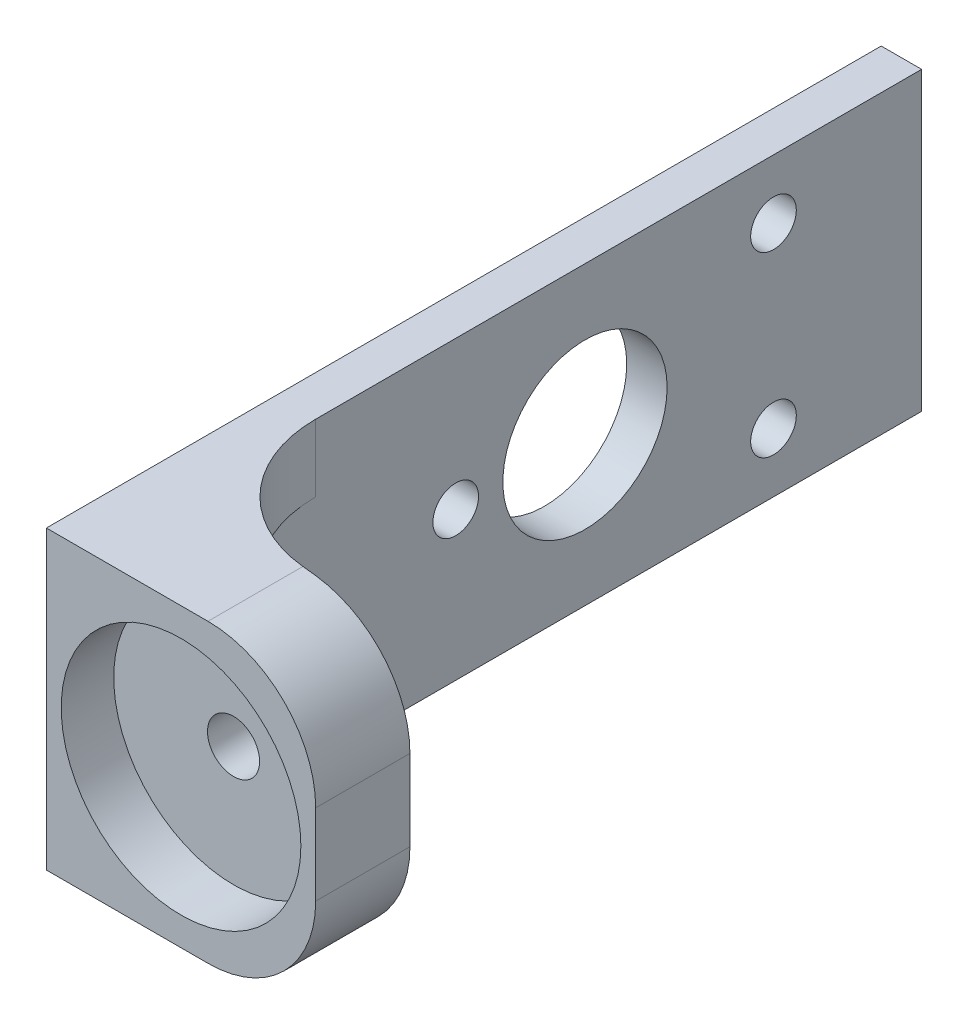
ISO-10303-21;
HEADER;
FILE_DESCRIPTION(('STEP AP214'),'2;1');
FILE_NAME('part.step','',(''),(''),'','','');
FILE_SCHEMA(('AUTOMOTIVE_DESIGN { 1 0 10303 214 1 1 1 1 }'));
ENDSEC;
DATA;
#1=APPLICATION_CONTEXT('core data for automotive mechanical design processes');
#2=APPLICATION_PROTOCOL_DEFINITION('international standard','automotive_design',2000,#1);
#3=PRODUCT_CONTEXT('',#1,'mechanical');
#4=PRODUCT('Part','Part','',(#3));
#5=PRODUCT_RELATED_PRODUCT_CATEGORY('part','',(#4));
#6=PRODUCT_DEFINITION_FORMATION('','',#4);
#7=PRODUCT_DEFINITION_CONTEXT('part definition',#1,'design');
#8=PRODUCT_DEFINITION('design','',#6,#7);
#9=PRODUCT_DEFINITION_SHAPE('','',#8);
#10=(LENGTH_UNIT() NAMED_UNIT(*) SI_UNIT(.MILLI.,.METRE.));
#11=(NAMED_UNIT(*) PLANE_ANGLE_UNIT() SI_UNIT($,.RADIAN.));
#12=(NAMED_UNIT(*) SI_UNIT($,.STERADIAN.) SOLID_ANGLE_UNIT());
#13=UNCERTAINTY_MEASURE_WITH_UNIT(LENGTH_MEASURE(1.E-05),#10,'distance_accuracy_value','');
#14=(GEOMETRIC_REPRESENTATION_CONTEXT(3) GLOBAL_UNCERTAINTY_ASSIGNED_CONTEXT((#13)) GLOBAL_UNIT_ASSIGNED_CONTEXT((#10,
#11,#12)) REPRESENTATION_CONTEXT('',''));
#15=CARTESIAN_POINT('',(0.,0.,0.));
#16=DIRECTION('',(0.,0.,1.));
#17=DIRECTION('',(1.,0.,0.));
#18=AXIS2_PLACEMENT_3D('',#15,#16,#17);
#19=CARTESIAN_POINT('',(3.81,27.94,0.));
#20=DIRECTION('',(1.,0.,0.));
#21=DIRECTION('',(0.,0.,-1.));
#22=AXIS2_PLACEMENT_3D('',#19,#20,#21);
#23=PLANE('',#22);
#24=CARTESIAN_POINT('',(3.81,22.352,-64.77));
#25=DIRECTION('',(1.,0.,0.));
#26=DIRECTION('',(0.,0.,-1.));
#27=AXIS2_PLACEMENT_3D('',#24,#25,#26);
#28=CIRCLE('',#27,2.15265);
#29=CARTESIAN_POINT('',(3.81,22.352,-66.92265));
#30=VERTEX_POINT('',#29);
#31=EDGE_CURVE('E209',#30,#30,#28,.T.);
#32=ORIENTED_EDGE('',*,*,#31,.F.);
#33=EDGE_LOOP('',(#32));
#34=FACE_BOUND('',#33,.T.);
#35=CARTESIAN_POINT('',(3.81,5.588,-64.77));
#36=DIRECTION('',(1.,0.,0.));
#37=DIRECTION('',(0.,0.,-1.));
#38=AXIS2_PLACEMENT_3D('',#35,#36,#37);
#39=CIRCLE('',#38,2.15265);
#40=CARTESIAN_POINT('',(3.81,5.588,-66.92265));
#41=VERTEX_POINT('',#40);
#42=EDGE_CURVE('E327',#41,#41,#39,.T.);
#43=ORIENTED_EDGE('',*,*,#42,.F.);
#44=EDGE_LOOP('',(#43));
#45=FACE_BOUND('',#44,.T.);
#46=CARTESIAN_POINT('',(3.81,13.97,-34.798));
#47=DIRECTION('',(1.,0.,0.));
#48=DIRECTION('',(0.,0.,-1.));
#49=AXIS2_PLACEMENT_3D('',#46,#47,#48);
#50=CIRCLE('',#49,2.15265);
#51=CARTESIAN_POINT('',(3.81,13.97,-36.95065));
#52=VERTEX_POINT('',#51);
#53=EDGE_CURVE('E335',#52,#52,#50,.T.);
#54=ORIENTED_EDGE('',*,*,#53,.F.);
#55=EDGE_LOOP('',(#54));
#56=FACE_BOUND('',#55,.T.);
#57=CARTESIAN_POINT('',(3.81,13.97,-46.99));
#58=DIRECTION('',(1.,0.,0.));
#59=DIRECTION('',(0.,0.,-1.));
#60=AXIS2_PLACEMENT_3D('',#57,#58,#59);
#61=CIRCLE('',#60,7.747);
#62=CARTESIAN_POINT('',(3.81,13.97,-54.737));
#63=VERTEX_POINT('',#62);
#64=EDGE_CURVE('E341',#63,#63,#61,.T.);
#65=ORIENTED_EDGE('',*,*,#64,.F.);
#66=EDGE_LOOP('',(#65));
#67=FACE_BOUND('',#66,.T.);
#68=DIRECTION('',(0.,0.,1.));
#69=VECTOR('',#68,1.);
#70=CARTESIAN_POINT('',(3.81,27.94,0.));
#71=LINE('',#70,#69);
#72=CARTESIAN_POINT('',(3.81,27.94,-78.74));
#73=VERTEX_POINT('',#72);
#74=CARTESIAN_POINT('',(3.81,27.94,-21.59));
#75=VERTEX_POINT('',#74);
#76=EDGE_CURVE('E146',#73,#75,#71,.T.);
#77=ORIENTED_EDGE('',*,*,#76,.T.);
#78=DIRECTION('',(0.,-1.,0.));
#79=VECTOR('',#78,1.);
#80=CARTESIAN_POINT('',(3.81,6.35,-21.59));
#81=LINE('',#80,#79);
#82=CARTESIAN_POINT('',(3.81,21.59,-21.59));
#83=VERTEX_POINT('',#82);
#84=EDGE_CURVE('E212',#75,#83,#81,.T.);
#85=ORIENTED_EDGE('',*,*,#84,.T.);
#86=DIRECTION('',(0.,0.,1.));
#87=VECTOR('',#86,1.);
#88=CARTESIAN_POINT('',(3.81,21.59,0.));
#89=LINE('',#88,#87);
#90=CARTESIAN_POINT('',(3.81,21.59,-8.89));
#91=VERTEX_POINT('',#90);
#92=EDGE_CURVE('E206',#83,#91,#89,.T.);
#93=ORIENTED_EDGE('',*,*,#92,.T.);
#94=DIRECTION('',(0.,-1.,0.));
#95=VECTOR('',#94,1.);
#96=CARTESIAN_POINT('',(3.81,27.94,-8.89));
#97=LINE('',#96,#95);
#98=CARTESIAN_POINT('',(3.81,6.35,-8.89));
#99=VERTEX_POINT('',#98);
#100=EDGE_CURVE('E174',#91,#99,#97,.T.);
#101=ORIENTED_EDGE('',*,*,#100,.T.);
#102=DIRECTION('',(0.,0.,-1.));
#103=VECTOR('',#102,1.);
#104=CARTESIAN_POINT('',(3.81,6.35,0.));
#105=LINE('',#104,#103);
#106=CARTESIAN_POINT('',(3.81,6.35,-21.59));
#107=VERTEX_POINT('',#106);
#108=EDGE_CURVE('E195',#99,#107,#105,.T.);
#109=ORIENTED_EDGE('',*,*,#108,.T.);
#110=DIRECTION('',(0.,-1.,0.));
#111=VECTOR('',#110,1.);
#112=CARTESIAN_POINT('',(3.81,0.,-21.59));
#113=LINE('',#112,#111);
#114=CARTESIAN_POINT('',(3.81,0.,-21.59));
#115=VERTEX_POINT('',#114);
#116=EDGE_CURVE('E154',#107,#115,#113,.T.);
#117=ORIENTED_EDGE('',*,*,#116,.T.);
#118=DIRECTION('',(0.,0.,1.));
#119=VECTOR('',#118,1.);
#120=CARTESIAN_POINT('',(3.81,0.,0.));
#121=LINE('',#120,#119);
#122=CARTESIAN_POINT('',(3.81,0.,-78.74));
#123=VERTEX_POINT('',#122);
#124=EDGE_CURVE('E149',#123,#115,#121,.T.);
#125=ORIENTED_EDGE('',*,*,#124,.F.);
#126=DIRECTION('',(0.,-1.,0.));
#127=VECTOR('',#126,1.);
#128=CARTESIAN_POINT('',(3.81,27.94,-78.74));
#129=LINE('',#128,#127);
#130=EDGE_CURVE('E143',#73,#123,#129,.T.);
#131=ORIENTED_EDGE('',*,*,#130,.F.);
#132=EDGE_LOOP('',(#77,#85,#93,#101,#109,#117,#125,#131));
#133=FACE_BOUND('',#132,.T.);
#134=ADVANCED_FACE('F47',(#34,#45,#56,#67,#133),#23,.T.);
#135=CARTESIAN_POINT('',(0.,27.94,-78.74));
#136=DIRECTION('',(0.,0.,-1.));
#137=DIRECTION('',(-1.,0.,0.));
#138=AXIS2_PLACEMENT_3D('',#135,#136,#137);
#139=PLANE('',#138);
#140=DIRECTION('',(1.,0.,0.));
#141=VECTOR('',#140,1.);
#142=CARTESIAN_POINT('',(0.,0.,-78.74));
#143=LINE('',#142,#141);
#144=CARTESIAN_POINT('',(0.,0.,-78.74));
#145=VERTEX_POINT('',#144);
#146=EDGE_CURVE('E176',#145,#123,#143,.T.);
#147=ORIENTED_EDGE('',*,*,#146,.F.);
#148=DIRECTION('',(0.,-1.,0.));
#149=VECTOR('',#148,1.);
#150=CARTESIAN_POINT('',(0.,27.94,-78.74));
#151=LINE('',#150,#149);
#152=CARTESIAN_POINT('',(0.,27.94,-78.74));
#153=VERTEX_POINT('',#152);
#154=EDGE_CURVE('E155',#153,#145,#151,.T.);
#155=ORIENTED_EDGE('',*,*,#154,.F.);
#156=DIRECTION('',(1.,0.,0.));
#157=VECTOR('',#156,1.);
#158=CARTESIAN_POINT('',(0.,27.94,-78.74));
#159=LINE('',#158,#157);
#160=EDGE_CURVE('E160',#153,#73,#159,.T.);
#161=ORIENTED_EDGE('',*,*,#160,.T.);
#162=ORIENTED_EDGE('',*,*,#130,.T.);
#163=EDGE_LOOP('',(#147,#155,#161,#162));
#164=FACE_BOUND('',#163,.T.);
#165=ADVANCED_FACE('F165',(#164),#139,.T.);
#166=CARTESIAN_POINT('',(0.,27.94,0.));
#167=DIRECTION('',(1.,0.,0.));
#168=DIRECTION('',(0.,0.,-1.));
#169=AXIS2_PLACEMENT_3D('',#166,#167,#168);
#170=PLANE('',#169);
#171=CARTESIAN_POINT('',(0.,22.352,-64.77));
#172=DIRECTION('',(1.,0.,0.));
#173=DIRECTION('',(0.,0.,-1.));
#174=AXIS2_PLACEMENT_3D('',#171,#172,#173);
#175=CIRCLE('',#174,2.15265);
#176=CARTESIAN_POINT('',(0.,22.352,-66.92265));
#177=VERTEX_POINT('',#176);
#178=EDGE_CURVE('E324',#177,#177,#175,.T.);
#179=ORIENTED_EDGE('',*,*,#178,.T.);
#180=EDGE_LOOP('',(#179));
#181=FACE_BOUND('',#180,.T.);
#182=CARTESIAN_POINT('',(0.,5.588,-64.77));
#183=DIRECTION('',(1.,0.,0.));
#184=DIRECTION('',(0.,0.,-1.));
#185=AXIS2_PLACEMENT_3D('',#182,#183,#184);
#186=CIRCLE('',#185,2.15265);
#187=CARTESIAN_POINT('',(0.,5.588,-66.92265));
#188=VERTEX_POINT('',#187);
#189=EDGE_CURVE('E332',#188,#188,#186,.T.);
#190=ORIENTED_EDGE('',*,*,#189,.T.);
#191=EDGE_LOOP('',(#190));
#192=FACE_BOUND('',#191,.T.);
#193=CARTESIAN_POINT('',(0.,13.97,-34.798));
#194=DIRECTION('',(1.,0.,0.));
#195=DIRECTION('',(0.,0.,-1.));
#196=AXIS2_PLACEMENT_3D('',#193,#194,#195);
#197=CIRCLE('',#196,2.15265);
#198=CARTESIAN_POINT('',(0.,13.97,-36.95065));
#199=VERTEX_POINT('',#198);
#200=EDGE_CURVE('E338',#199,#199,#197,.T.);
#201=ORIENTED_EDGE('',*,*,#200,.T.);
#202=EDGE_LOOP('',(#201));
#203=FACE_BOUND('',#202,.T.);
#204=CARTESIAN_POINT('',(0.,13.97,-46.99));
#205=DIRECTION('',(1.,0.,0.));
#206=DIRECTION('',(0.,0.,-1.));
#207=AXIS2_PLACEMENT_3D('',#204,#205,#206);
#208=CIRCLE('',#207,7.747);
#209=CARTESIAN_POINT('',(0.,13.97,-54.737));
#210=VERTEX_POINT('',#209);
#211=EDGE_CURVE('E344',#210,#210,#208,.F.);
#212=ORIENTED_EDGE('',*,*,#211,.F.);
#213=EDGE_LOOP('',(#212));
#214=FACE_BOUND('',#213,.T.);
#215=DIRECTION('',(0.,0.,1.));
#216=VECTOR('',#215,1.);
#217=CARTESIAN_POINT('',(0.,0.,0.));
#218=LINE('',#217,#216);
#219=CARTESIAN_POINT('',(0.,0.,0.));
#220=VERTEX_POINT('',#219);
#221=EDGE_CURVE('E179',#145,#220,#218,.T.);
#222=ORIENTED_EDGE('',*,*,#221,.T.);
#223=DIRECTION('',(0.,-1.,0.));
#224=VECTOR('',#223,1.);
#225=CARTESIAN_POINT('',(0.,27.94,0.));
#226=LINE('',#225,#224);
#227=CARTESIAN_POINT('',(0.,27.94,0.));
#228=VERTEX_POINT('',#227);
#229=EDGE_CURVE('E190',#228,#220,#226,.T.);
#230=ORIENTED_EDGE('',*,*,#229,.F.);
#231=DIRECTION('',(0.,0.,1.));
#232=VECTOR('',#231,1.);
#233=CARTESIAN_POINT('',(0.,27.94,0.));
#234=LINE('',#233,#232);
#235=EDGE_CURVE('E167',#153,#228,#234,.T.);
#236=ORIENTED_EDGE('',*,*,#235,.F.);
#237=ORIENTED_EDGE('',*,*,#154,.T.);
#238=EDGE_LOOP('',(#222,#230,#236,#237));
#239=FACE_BOUND('',#238,.T.);
#240=ADVANCED_FACE('F268',(#181,#192,#203,#214,#239),#170,.F.);
#241=CARTESIAN_POINT('',(0.,27.94,0.));
#242=DIRECTION('',(0.,0.,-1.));
#243=DIRECTION('',(-1.,0.,0.));
#244=AXIS2_PLACEMENT_3D('',#241,#242,#243);
#245=PLANE('',#244);
#246=CARTESIAN_POINT('',(12.7,13.97,0.));
#247=DIRECTION('',(0.,0.,1.));
#248=DIRECTION('',(1.,0.,0.));
#249=AXIS2_PLACEMENT_3D('',#246,#247,#248);
#250=CIRCLE('',#249,11.303);
#251=CARTESIAN_POINT('',(24.003,13.97,0.));
#252=VERTEX_POINT('',#251);
#253=EDGE_CURVE('E353',#252,#252,#250,.T.);
#254=ORIENTED_EDGE('',*,*,#253,.F.);
#255=EDGE_LOOP('',(#254));
#256=FACE_BOUND('',#255,.T.);
#257=DIRECTION('',(1.,0.,0.));
#258=VECTOR('',#257,1.);
#259=CARTESIAN_POINT('',(0.,0.,0.));
#260=LINE('',#259,#258);
#261=CARTESIAN_POINT('',(15.24,0.,0.));
#262=VERTEX_POINT('',#261);
#263=EDGE_CURVE('E163',#220,#262,#260,.T.);
#264=ORIENTED_EDGE('',*,*,#263,.T.);
#265=CARTESIAN_POINT('',(15.24,10.16,0.));
#266=DIRECTION('',(0.,0.,-1.));
#267=DIRECTION('',(-1.,0.,0.));
#268=AXIS2_PLACEMENT_3D('',#265,#266,#267);
#269=CIRCLE('',#268,10.16);
#270=CARTESIAN_POINT('',(25.4,10.16,0.));
#271=VERTEX_POINT('',#270);
#272=EDGE_CURVE('E360',#262,#271,#269,.F.);
#273=ORIENTED_EDGE('',*,*,#272,.T.);
#274=DIRECTION('',(0.,-1.,0.));
#275=VECTOR('',#274,1.);
#276=CARTESIAN_POINT('',(25.4,27.94,0.));
#277=LINE('',#276,#275);
#278=CARTESIAN_POINT('',(25.4,17.78,0.));
#279=VERTEX_POINT('',#278);
#280=EDGE_CURVE('E187',#279,#271,#277,.T.);
#281=ORIENTED_EDGE('',*,*,#280,.F.);
#282=CARTESIAN_POINT('',(15.24,17.78,0.));
#283=DIRECTION('',(0.,0.,-1.));
#284=DIRECTION('',(-1.,0.,0.));
#285=AXIS2_PLACEMENT_3D('',#282,#283,#284);
#286=CIRCLE('',#285,10.16);
#287=CARTESIAN_POINT('',(15.24,27.94,0.));
#288=VERTEX_POINT('',#287);
#289=EDGE_CURVE('E74',#279,#288,#286,.F.);
#290=ORIENTED_EDGE('',*,*,#289,.T.);
#291=DIRECTION('',(1.,0.,0.));
#292=VECTOR('',#291,1.);
#293=CARTESIAN_POINT('',(0.,27.94,0.));
#294=LINE('',#293,#292);
#295=EDGE_CURVE('E169',#228,#288,#294,.T.);
#296=ORIENTED_EDGE('',*,*,#295,.F.);
#297=ORIENTED_EDGE('',*,*,#229,.T.);
#298=EDGE_LOOP('',(#264,#273,#281,#290,#296,#297));
#299=FACE_BOUND('',#298,.T.);
#300=ADVANCED_FACE('F275',(#256,#299),#245,.F.);
#301=CARTESIAN_POINT('',(25.4,27.94,0.));
#302=DIRECTION('',(-1.,0.,0.));
#303=DIRECTION('',(0.,0.,1.));
#304=AXIS2_PLACEMENT_3D('',#301,#302,#303);
#305=PLANE('',#304);
#306=ORIENTED_EDGE('',*,*,#280,.T.);
#307=DIRECTION('',(0.,0.,-1.));
#308=VECTOR('',#307,1.);
#309=CARTESIAN_POINT('',(25.4,10.16,0.));
#310=LINE('',#309,#308);
#311=CARTESIAN_POINT('',(25.4,10.16,-8.89));
#312=VERTEX_POINT('',#311);
#313=EDGE_CURVE('E223',#271,#312,#310,.T.);
#314=ORIENTED_EDGE('',*,*,#313,.T.);
#315=DIRECTION('',(0.,-1.,0.));
#316=VECTOR('',#315,1.);
#317=CARTESIAN_POINT('',(25.4,27.94,-8.89));
#318=LINE('',#317,#316);
#319=CARTESIAN_POINT('',(25.4,17.78,-8.89));
#320=VERTEX_POINT('',#319);
#321=EDGE_CURVE('E184',#320,#312,#318,.T.);
#322=ORIENTED_EDGE('',*,*,#321,.F.);
#323=DIRECTION('',(0.,0.,-1.));
#324=VECTOR('',#323,1.);
#325=CARTESIAN_POINT('',(25.4,17.78,0.));
#326=LINE('',#325,#324);
#327=EDGE_CURVE('E220',#320,#279,#326,.F.);
#328=ORIENTED_EDGE('',*,*,#327,.T.);
#329=EDGE_LOOP('',(#306,#314,#322,#328));
#330=FACE_BOUND('',#329,.T.);
#331=ADVANCED_FACE('F278',(#330),#305,.F.);
#332=CARTESIAN_POINT('',(0.,27.94,-8.89));
#333=DIRECTION('',(0.,0.,-1.));
#334=DIRECTION('',(-1.,0.,0.));
#335=AXIS2_PLACEMENT_3D('',#332,#333,#334);
#336=PLANE('',#335);
#337=CARTESIAN_POINT('',(12.7,13.97,-8.89));
#338=DIRECTION('',(0.,0.,-1.));
#339=DIRECTION('',(-1.,0.,0.));
#340=AXIS2_PLACEMENT_3D('',#337,#338,#339);
#341=CIRCLE('',#340,2.45745);
#342=CARTESIAN_POINT('',(10.24255,13.97,-8.89));
#343=VERTEX_POINT('',#342);
#344=EDGE_CURVE('E350',#343,#343,#341,.T.);
#345=ORIENTED_EDGE('',*,*,#344,.F.);
#346=EDGE_LOOP('',(#345));
#347=FACE_BOUND('',#346,.T.);
#348=ORIENTED_EDGE('',*,*,#321,.T.);
#349=CARTESIAN_POINT('',(15.24,10.16,-8.89));
#350=DIRECTION('',(0.,0.,-1.));
#351=DIRECTION('',(-1.,0.,0.));
#352=AXIS2_PLACEMENT_3D('',#349,#350,#351);
#353=CIRCLE('',#352,10.16);
#354=CARTESIAN_POINT('',(16.51,0.0796875048439082,-8.89));
#355=VERTEX_POINT('',#354);
#356=EDGE_CURVE('E228',#312,#355,#353,.T.);
#357=ORIENTED_EDGE('',*,*,#356,.T.);
#358=DIRECTION('',(0.,-1.,0.));
#359=VECTOR('',#358,1.);
#360=CARTESIAN_POINT('',(16.51,27.94,-8.89));
#361=LINE('',#360,#359);
#362=CARTESIAN_POINT('',(16.51,6.35,-8.89));
#363=VERTEX_POINT('',#362);
#364=EDGE_CURVE('E201',#355,#363,#361,.F.);
#365=ORIENTED_EDGE('',*,*,#364,.T.);
#366=DIRECTION('',(-1.,0.,0.));
#367=VECTOR('',#366,1.);
#368=CARTESIAN_POINT('',(0.,6.35,-8.89));
#369=LINE('',#368,#367);
#370=EDGE_CURVE('E198',#363,#99,#369,.T.);
#371=ORIENTED_EDGE('',*,*,#370,.T.);
#372=ORIENTED_EDGE('',*,*,#100,.F.);
#373=DIRECTION('',(1.,0.,0.));
#374=VECTOR('',#373,1.);
#375=CARTESIAN_POINT('',(0.,21.59,-8.89));
#376=LINE('',#375,#374);
#377=CARTESIAN_POINT('',(16.51,21.59,-8.89));
#378=VERTEX_POINT('',#377);
#379=EDGE_CURVE('E217',#91,#378,#376,.T.);
#380=ORIENTED_EDGE('',*,*,#379,.T.);
#381=DIRECTION('',(0.,-1.,0.));
#382=VECTOR('',#381,1.);
#383=CARTESIAN_POINT('',(16.51,27.94,-8.89));
#384=LINE('',#383,#382);
#385=CARTESIAN_POINT('',(16.51,27.8603124951561,-8.89));
#386=VERTEX_POINT('',#385);
#387=EDGE_CURVE('E214',#378,#386,#384,.F.);
#388=ORIENTED_EDGE('',*,*,#387,.T.);
#389=CARTESIAN_POINT('',(15.24,17.78,-8.89));
#390=DIRECTION('',(0.,0.,-1.));
#391=DIRECTION('',(-1.,0.,0.));
#392=AXIS2_PLACEMENT_3D('',#389,#390,#391);
#393=CIRCLE('',#392,10.16);
#394=EDGE_CURVE('E226',#386,#320,#393,.T.);
#395=ORIENTED_EDGE('',*,*,#394,.T.);
#396=EDGE_LOOP('',(#348,#357,#365,#371,#372,#380,#388,#395));
#397=FACE_BOUND('',#396,.T.);
#398=ADVANCED_FACE('F282',(#347,#397),#336,.T.);
#399=CARTESIAN_POINT('',(0.,27.94,0.));
#400=DIRECTION('',(0.,1.,0.));
#401=DIRECTION('',(0.,0.,1.));
#402=AXIS2_PLACEMENT_3D('',#399,#400,#401);
#403=PLANE('',#402);
#404=ORIENTED_EDGE('',*,*,#295,.T.);
#405=DIRECTION('',(0.,0.,-1.));
#406=VECTOR('',#405,1.);
#407=CARTESIAN_POINT('',(15.24,27.94,-8.89));
#408=LINE('',#407,#406);
#409=CARTESIAN_POINT('',(15.24,27.94,-8.95365954874593));
#410=VERTEX_POINT('',#409);
#411=EDGE_CURVE('E61',#288,#410,#408,.T.);
#412=ORIENTED_EDGE('',*,*,#411,.T.);
#413=CARTESIAN_POINT('',(16.51,27.94,-21.59));
#414=DIRECTION('',(0.,1.,0.));
#415=DIRECTION('',(0.,0.,1.));
#416=AXIS2_PLACEMENT_3D('',#413,#414,#415);
#417=CIRCLE('',#416,12.7);
#418=EDGE_CURVE('E162',#410,#75,#417,.F.);
#419=ORIENTED_EDGE('',*,*,#418,.T.);
#420=ORIENTED_EDGE('',*,*,#76,.F.);
#421=ORIENTED_EDGE('',*,*,#160,.F.);
#422=ORIENTED_EDGE('',*,*,#235,.T.);
#423=EDGE_LOOP('',(#404,#412,#419,#420,#421,#422));
#424=FACE_BOUND('',#423,.T.);
#425=ADVANCED_FACE('F159',(#424),#403,.T.);
#426=CARTESIAN_POINT('',(0.,0.,0.));
#427=DIRECTION('',(0.,1.,0.));
#428=DIRECTION('',(0.,0.,1.));
#429=AXIS2_PLACEMENT_3D('',#426,#427,#428);
#430=PLANE('',#429);
#431=CARTESIAN_POINT('',(16.51,0.,-21.59));
#432=DIRECTION('',(0.,1.,0.));
#433=DIRECTION('',(0.,0.,1.));
#434=AXIS2_PLACEMENT_3D('',#431,#432,#433);
#435=CIRCLE('',#434,12.7);
#436=CARTESIAN_POINT('',(15.24,0.,-8.95365954874593));
#437=VERTEX_POINT('',#436);
#438=EDGE_CURVE('E203',#115,#437,#435,.T.);
#439=ORIENTED_EDGE('',*,*,#438,.T.);
#440=DIRECTION('',(0.,0.,-1.));
#441=VECTOR('',#440,1.);
#442=CARTESIAN_POINT('',(15.24,0.,0.));
#443=LINE('',#442,#441);
#444=EDGE_CURVE('E237',#437,#262,#443,.F.);
#445=ORIENTED_EDGE('',*,*,#444,.T.);
#446=ORIENTED_EDGE('',*,*,#263,.F.);
#447=ORIENTED_EDGE('',*,*,#221,.F.);
#448=ORIENTED_EDGE('',*,*,#146,.T.);
#449=ORIENTED_EDGE('',*,*,#124,.T.);
#450=EDGE_LOOP('',(#439,#445,#446,#447,#448,#449));
#451=FACE_BOUND('',#450,.T.);
#452=ADVANCED_FACE('F287',(#451),#430,.F.);
#453=CARTESIAN_POINT('',(12.7,13.97,-4.953));
#454=DIRECTION('',(0.,0.,1.));
#455=DIRECTION('',(1.,0.,0.));
#456=AXIS2_PLACEMENT_3D('',#453,#454,#455);
#457=CYLINDRICAL_SURFACE('',#456,11.303);
#458=CARTESIAN_POINT('',(12.7,13.97,-4.953));
#459=DIRECTION('',(0.,0.,1.));
#460=DIRECTION('',(1.,0.,0.));
#461=AXIS2_PLACEMENT_3D('',#458,#459,#460);
#462=CIRCLE('',#461,11.303);
#463=CARTESIAN_POINT('',(24.003,13.97,-4.953));
#464=VERTEX_POINT('',#463);
#465=EDGE_CURVE('E177',#464,#464,#462,.T.);
#466=ORIENTED_EDGE('',*,*,#465,.F.);
#467=EDGE_LOOP('',(#466));
#468=FACE_BOUND('',#467,.T.);
#469=ORIENTED_EDGE('',*,*,#253,.T.);
#470=EDGE_LOOP('',(#469));
#471=FACE_BOUND('',#470,.T.);
#472=ADVANCED_FACE('F290',(#468,#471),#457,.F.);
#473=CARTESIAN_POINT('',(12.7,13.97,-4.953));
#474=DIRECTION('',(0.,0.,1.));
#475=DIRECTION('',(1.,0.,0.));
#476=AXIS2_PLACEMENT_3D('',#473,#474,#475);
#477=PLANE('',#476);
#478=CARTESIAN_POINT('',(12.7,13.97,-4.953));
#479=DIRECTION('',(0.,0.,1.));
#480=DIRECTION('',(1.,0.,0.));
#481=AXIS2_PLACEMENT_3D('',#478,#479,#480);
#482=CIRCLE('',#481,2.45745);
#483=CARTESIAN_POINT('',(15.15745,13.97,-4.953));
#484=VERTEX_POINT('',#483);
#485=EDGE_CURVE('E347',#484,#484,#482,.T.);
#486=ORIENTED_EDGE('',*,*,#485,.F.);
#487=EDGE_LOOP('',(#486));
#488=FACE_BOUND('',#487,.T.);
#489=ORIENTED_EDGE('',*,*,#465,.T.);
#490=EDGE_LOOP('',(#489));
#491=FACE_BOUND('',#490,.T.);
#492=ADVANCED_FACE('F296',(#488,#491),#477,.T.);
#493=CARTESIAN_POINT('',(12.7,13.97,-4.953));
#494=DIRECTION('',(0.,0.,1.));
#495=DIRECTION('',(1.,0.,0.));
#496=AXIS2_PLACEMENT_3D('',#493,#494,#495);
#497=CYLINDRICAL_SURFACE('',#496,2.45745);
#498=ORIENTED_EDGE('',*,*,#485,.T.);
#499=EDGE_LOOP('',(#498));
#500=FACE_BOUND('',#499,.T.);
#501=ORIENTED_EDGE('',*,*,#344,.T.);
#502=EDGE_LOOP('',(#501));
#503=FACE_BOUND('',#502,.T.);
#504=ADVANCED_FACE('F300',(#500,#503),#497,.F.);
#505=CARTESIAN_POINT('',(-0.00100000000000967,13.97,-46.99));
#506=DIRECTION('',(1.,0.,0.));
#507=DIRECTION('',(0.,0.,-1.));
#508=AXIS2_PLACEMENT_3D('',#505,#506,#507);
#509=CYLINDRICAL_SURFACE('',#508,7.747);
#510=ORIENTED_EDGE('',*,*,#64,.T.);
#511=EDGE_LOOP('',(#510));
#512=FACE_BOUND('',#511,.T.);
#513=ORIENTED_EDGE('',*,*,#211,.T.);
#514=EDGE_LOOP('',(#513));
#515=FACE_BOUND('',#514,.T.);
#516=ADVANCED_FACE('F304',(#512,#515),#509,.F.);
#517=CARTESIAN_POINT('',(3.81,13.97,-34.798));
#518=DIRECTION('',(1.,0.,0.));
#519=DIRECTION('',(0.,0.,-1.));
#520=AXIS2_PLACEMENT_3D('',#517,#518,#519);
#521=CYLINDRICAL_SURFACE('',#520,2.15265);
#522=ORIENTED_EDGE('',*,*,#200,.F.);
#523=EDGE_LOOP('',(#522));
#524=FACE_BOUND('',#523,.T.);
#525=ORIENTED_EDGE('',*,*,#53,.T.);
#526=EDGE_LOOP('',(#525));
#527=FACE_BOUND('',#526,.T.);
#528=ADVANCED_FACE('F308',(#524,#527),#521,.F.);
#529=CARTESIAN_POINT('',(3.81,5.588,-64.77));
#530=DIRECTION('',(1.,0.,0.));
#531=DIRECTION('',(0.,0.,-1.));
#532=AXIS2_PLACEMENT_3D('',#529,#530,#531);
#533=CYLINDRICAL_SURFACE('',#532,2.15265);
#534=ORIENTED_EDGE('',*,*,#189,.F.);
#535=EDGE_LOOP('',(#534));
#536=FACE_BOUND('',#535,.T.);
#537=ORIENTED_EDGE('',*,*,#42,.T.);
#538=EDGE_LOOP('',(#537));
#539=FACE_BOUND('',#538,.T.);
#540=ADVANCED_FACE('F312',(#536,#539),#533,.F.);
#541=CARTESIAN_POINT('',(3.81,22.352,-64.77));
#542=DIRECTION('',(1.,0.,0.));
#543=DIRECTION('',(0.,0.,-1.));
#544=AXIS2_PLACEMENT_3D('',#541,#542,#543);
#545=CYLINDRICAL_SURFACE('',#544,2.15265);
#546=ORIENTED_EDGE('',*,*,#178,.F.);
#547=EDGE_LOOP('',(#546));
#548=FACE_BOUND('',#547,.T.);
#549=ORIENTED_EDGE('',*,*,#31,.T.);
#550=EDGE_LOOP('',(#549));
#551=FACE_BOUND('',#550,.T.);
#552=ADVANCED_FACE('F247',(#548,#551),#545,.F.);
#553=CARTESIAN_POINT('',(16.51,27.94,-21.59));
#554=DIRECTION('',(0.,1.,0.));
#555=DIRECTION('',(0.,0.,1.));
#556=AXIS2_PLACEMENT_3D('',#553,#554,#555);
#557=CYLINDRICAL_SURFACE('',#556,12.7);
#558=ORIENTED_EDGE('',*,*,#364,.F.);
#559=CARTESIAN_POINT('',(16.51,0.0796875048439099,-8.89));
#560=CARTESIAN_POINT('',(16.404461393881,0.0663889239078654,-8.88999798481131));
#561=CARTESIAN_POINT('',(16.2987131516252,0.0547516273112541,-8.89131556131239));
#562=CARTESIAN_POINT('',(16.0871393920107,0.0348226198066879,-8.89660187200031));
#563=CARTESIAN_POINT('',(15.9813142711656,0.0265255686006667,-8.90056634719452));
#564=CARTESIAN_POINT('',(15.7695888294619,0.0132573391486825,-8.91115832593307));
#565=CARTESIAN_POINT('',(15.6636885086031,0.00828616090756465,-8.91778582948129));
#566=CARTESIAN_POINT('',(15.4518138946484,0.00165385010836036,-8.9337146299897));
#567=CARTESIAN_POINT('',(15.3458397563647,-1.94782796744217E-06,-8.94302020864678));
#568=CARTESIAN_POINT('',(15.24,0.,-8.95365954874593));
#569=B_SPLINE_CURVE_WITH_KNOTS('',3,(#559,#560,#561,#562,#563,#564,#565,#566,#567,#568),
.UNSPECIFIED.,.F.,.F.,(4,2,2,2,4),(0.,0.319098612761726,0.637685013315051,0.956271414332504,
1.27537002704345),.UNSPECIFIED.);
#570=EDGE_CURVE('E230',#355,#437,#569,.T.);
#571=ORIENTED_EDGE('',*,*,#570,.T.);
#572=ORIENTED_EDGE('',*,*,#438,.F.);
#573=ORIENTED_EDGE('',*,*,#116,.F.);
#574=CARTESIAN_POINT('',(16.51,6.35,-21.59));
#575=DIRECTION('',(0.,-1.,0.));
#576=DIRECTION('',(0.,0.,-1.));
#577=AXIS2_PLACEMENT_3D('',#574,#575,#576);
#578=CIRCLE('',#577,12.7);
#579=EDGE_CURVE('E207',#363,#107,#578,.T.);
#580=ORIENTED_EDGE('',*,*,#579,.F.);
#581=EDGE_LOOP('',(#558,#571,#572,#573,#580));
#582=FACE_BOUND('',#581,.T.);
#583=ADVANCED_FACE('F242',(#582),#557,.F.);
#584=CARTESIAN_POINT('',(16.51,6.35,-21.59));
#585=DIRECTION('',(0.,-1.,0.));
#586=DIRECTION('',(0.,0.,-1.));
#587=AXIS2_PLACEMENT_3D('',#584,#585,#586);
#588=PLANE('',#587);
#589=ORIENTED_EDGE('',*,*,#108,.F.);
#590=ORIENTED_EDGE('',*,*,#370,.F.);
#591=ORIENTED_EDGE('',*,*,#579,.T.);
#592=EDGE_LOOP('',(#589,#590,#591));
#593=FACE_BOUND('',#592,.T.);
#594=ADVANCED_FACE('F246',(#593),#588,.F.);
#595=CARTESIAN_POINT('',(16.51,21.59,-21.59));
#596=DIRECTION('',(0.,1.,0.));
#597=DIRECTION('',(0.,0.,1.));
#598=AXIS2_PLACEMENT_3D('',#595,#596,#597);
#599=PLANE('',#598);
#600=ORIENTED_EDGE('',*,*,#379,.F.);
#601=ORIENTED_EDGE('',*,*,#92,.F.);
#602=CARTESIAN_POINT('',(16.51,21.59,-21.59));
#603=DIRECTION('',(0.,1.,0.));
#604=DIRECTION('',(0.,0.,1.));
#605=AXIS2_PLACEMENT_3D('',#602,#603,#604);
#606=CIRCLE('',#605,12.7);
#607=EDGE_CURVE('E210',#378,#83,#606,.F.);
#608=ORIENTED_EDGE('',*,*,#607,.F.);
#609=EDGE_LOOP('',(#600,#601,#608));
#610=FACE_BOUND('',#609,.T.);
#611=ADVANCED_FACE('F253',(#610),#599,.F.);
#612=CARTESIAN_POINT('',(16.51,27.94,-21.59));
#613=DIRECTION('',(0.,1.,0.));
#614=DIRECTION('',(0.,0.,1.));
#615=AXIS2_PLACEMENT_3D('',#612,#613,#614);
#616=CYLINDRICAL_SURFACE('',#615,12.7);
#617=ORIENTED_EDGE('',*,*,#418,.F.);
#618=CARTESIAN_POINT('',(15.24,27.94,-8.95365954874593));
#619=CARTESIAN_POINT('',(15.3458397563647,27.940001947828,-8.94302020864678));
#620=CARTESIAN_POINT('',(15.4518138946484,27.9383461498916,-8.9337146299897));
#621=CARTESIAN_POINT('',(15.6636885086031,27.9317138390924,-8.91778582948129));
#622=CARTESIAN_POINT('',(15.7695888294619,27.9267426608513,-8.91115832593307));
#623=CARTESIAN_POINT('',(15.9813142711656,27.9134744313993,-8.90056634719452));
#624=CARTESIAN_POINT('',(16.0871393920107,27.9051773801933,-8.89660187200031));
#625=CARTESIAN_POINT('',(16.2987131516252,27.8852483726887,-8.89131556131239));
#626=CARTESIAN_POINT('',(16.404461393881,27.8736110760921,-8.88999798481131));
#627=CARTESIAN_POINT('',(16.51,27.8603124951561,-8.89));
#628=B_SPLINE_CURVE_WITH_KNOTS('',3,(#618,#619,#620,#621,#622,#623,#624,#625,#626,#627),
.UNSPECIFIED.,.F.,.F.,(4,2,2,2,4),(0.,0.319098612710951,0.637685013728408,0.956271414281733,
1.27537002704345),.UNSPECIFIED.);
#629=EDGE_CURVE('E11',#410,#386,#628,.T.);
#630=ORIENTED_EDGE('',*,*,#629,.T.);
#631=ORIENTED_EDGE('',*,*,#387,.F.);
#632=ORIENTED_EDGE('',*,*,#607,.T.);
#633=ORIENTED_EDGE('',*,*,#84,.F.);
#634=EDGE_LOOP('',(#617,#630,#631,#632,#633));
#635=FACE_BOUND('',#634,.T.);
#636=ADVANCED_FACE('F250',(#635),#616,.F.);
#637=CARTESIAN_POINT('',(15.24,10.16,0.));
#638=DIRECTION('',(0.,0.,-1.));
#639=DIRECTION('',(-1.,0.,0.));
#640=AXIS2_PLACEMENT_3D('',#637,#638,#639);
#641=CYLINDRICAL_SURFACE('',#640,10.16);
#642=ORIENTED_EDGE('',*,*,#272,.F.);
#643=ORIENTED_EDGE('',*,*,#444,.F.);
#644=ORIENTED_EDGE('',*,*,#570,.F.);
#645=ORIENTED_EDGE('',*,*,#356,.F.);
#646=ORIENTED_EDGE('',*,*,#313,.F.);
#647=EDGE_LOOP('',(#642,#643,#644,#645,#646));
#648=FACE_BOUND('',#647,.T.);
#649=ADVANCED_FACE('F239',(#648),#641,.T.);
#650=CARTESIAN_POINT('',(15.24,17.78,0.));
#651=DIRECTION('',(0.,0.,1.));
#652=DIRECTION('',(1.,0.,0.));
#653=AXIS2_PLACEMENT_3D('',#650,#651,#652);
#654=CYLINDRICAL_SURFACE('',#653,10.16);
#655=ORIENTED_EDGE('',*,*,#289,.F.);
#656=ORIENTED_EDGE('',*,*,#327,.F.);
#657=ORIENTED_EDGE('',*,*,#394,.F.);
#658=ORIENTED_EDGE('',*,*,#629,.F.);
#659=ORIENTED_EDGE('',*,*,#411,.F.);
#660=EDGE_LOOP('',(#655,#656,#657,#658,#659));
#661=FACE_BOUND('',#660,.T.);
#662=ADVANCED_FACE('F49',(#661),#654,.T.);
#663=CLOSED_SHELL('',(#134,#165,#240,#300,#331,#398,#425,#452,#472,#492,#504,#516,#528,#540,
#552,#583,#594,#611,#636,#649,#662));
#664=MANIFOLD_SOLID_BREP('B2',#663);
#665=ADVANCED_BREP_SHAPE_REPRESENTATION('',(#18,#664),#14);
#666=SHAPE_DEFINITION_REPRESENTATION(#9,#665);
ENDSEC;
END-ISO-10303-21;
